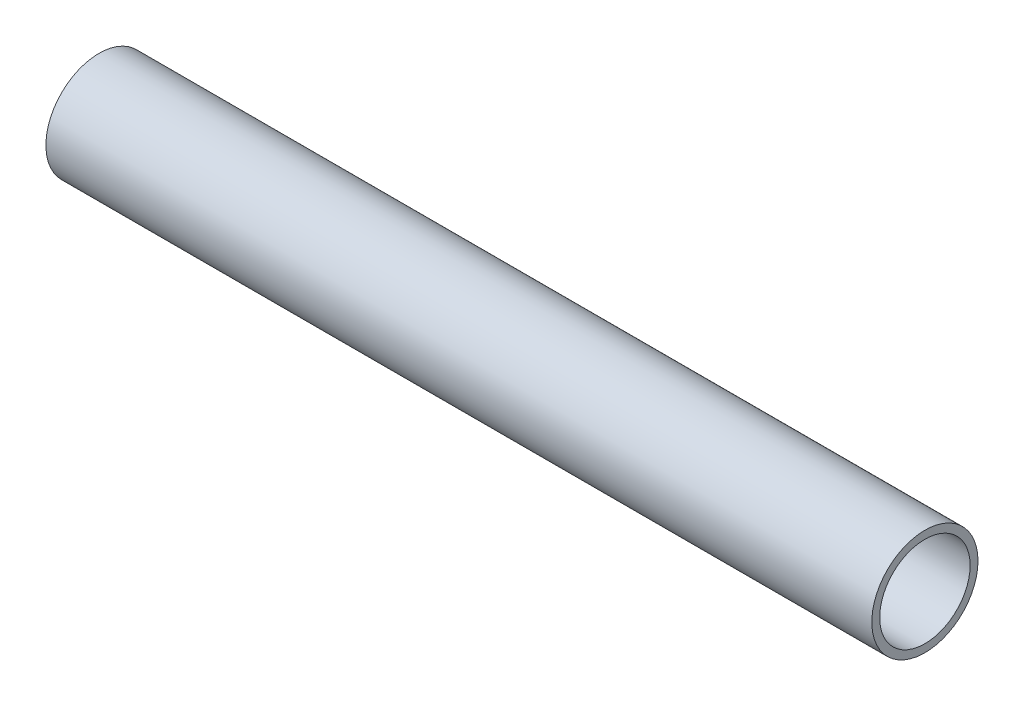
ISO-10303-21;
HEADER;
FILE_DESCRIPTION(('STEP AP214'),'2;1');
FILE_NAME('part.step','',(''),(''),'','','');
FILE_SCHEMA(('AUTOMOTIVE_DESIGN { 1 0 10303 214 1 1 1 1 }'));
ENDSEC;
DATA;
#1=APPLICATION_CONTEXT('core data for automotive mechanical design processes');
#2=APPLICATION_PROTOCOL_DEFINITION('international standard','automotive_design',2000,#1);
#3=PRODUCT_CONTEXT('',#1,'mechanical');
#4=PRODUCT('Part','Part','',(#3));
#5=PRODUCT_RELATED_PRODUCT_CATEGORY('part','',(#4));
#6=PRODUCT_DEFINITION_FORMATION('','',#4);
#7=PRODUCT_DEFINITION_CONTEXT('part definition',#1,'design');
#8=PRODUCT_DEFINITION('design','',#6,#7);
#9=PRODUCT_DEFINITION_SHAPE('','',#8);
#10=(LENGTH_UNIT() NAMED_UNIT(*) SI_UNIT(.MILLI.,.METRE.));
#11=(NAMED_UNIT(*) PLANE_ANGLE_UNIT() SI_UNIT($,.RADIAN.));
#12=(NAMED_UNIT(*) SI_UNIT($,.STERADIAN.) SOLID_ANGLE_UNIT());
#13=UNCERTAINTY_MEASURE_WITH_UNIT(LENGTH_MEASURE(1.E-05),#10,'distance_accuracy_value','');
#14=(GEOMETRIC_REPRESENTATION_CONTEXT(3) GLOBAL_UNCERTAINTY_ASSIGNED_CONTEXT((#13)) GLOBAL_UNIT_ASSIGNED_CONTEXT((#10,
#11,#12)) REPRESENTATION_CONTEXT('',''));
#15=CARTESIAN_POINT('',(0.,0.,0.));
#16=DIRECTION('',(0.,0.,1.));
#17=DIRECTION('',(1.,0.,0.));
#18=AXIS2_PLACEMENT_3D('',#15,#16,#17);
#19=CARTESIAN_POINT('',(-190.,300.,-250.));
#20=DIRECTION('',(-1.,0.,0.));
#21=DIRECTION('',(0.,0.,-1.));
#22=AXIS2_PLACEMENT_3D('',#19,#20,#21);
#23=CYLINDRICAL_SURFACE('',#22,13.5);
#24=CARTESIAN_POINT('',(-190.,300.,-250.));
#25=DIRECTION('',(1.,0.,0.));
#26=DIRECTION('',(0.,0.,-1.));
#27=AXIS2_PLACEMENT_3D('',#24,#25,#26);
#28=CIRCLE('',#27,13.5);
#29=CARTESIAN_POINT('',(-190.,300.,-263.5));
#30=VERTEX_POINT('',#29);
#31=EDGE_CURVE('E10',#30,#30,#28,.T.);
#32=CARTESIAN_POINT('',(-400.,300.,-250.));
#33=DIRECTION('',(1.,0.,0.));
#34=DIRECTION('',(0.,0.,-1.));
#35=AXIS2_PLACEMENT_3D('',#32,#33,#34);
#36=CIRCLE('',#35,13.5);
#37=CARTESIAN_POINT('',(-400.,300.,-263.5));
#38=VERTEX_POINT('',#37);
#39=EDGE_CURVE('E47',#38,#38,#36,.T.);
#40=CARTESIAN_POINT('',(-190.,300.,-263.5));
#41=CARTESIAN_POINT('',(-192.1875,300.,-263.5));
#42=CARTESIAN_POINT('',(-194.375,300.,-263.5));
#43=CARTESIAN_POINT('',(-198.75,300.,-263.5));
#44=CARTESIAN_POINT('',(-200.9375,300.,-263.5));
#45=CARTESIAN_POINT('',(-205.3125,300.,-263.5));
#46=CARTESIAN_POINT('',(-207.5,300.,-263.5));
#47=CARTESIAN_POINT('',(-211.875,300.,-263.5));
#48=CARTESIAN_POINT('',(-214.0625,300.,-263.5));
#49=CARTESIAN_POINT('',(-218.4375,300.,-263.5));
#50=CARTESIAN_POINT('',(-220.625,300.,-263.5));
#51=CARTESIAN_POINT('',(-225.,300.,-263.5));
#52=CARTESIAN_POINT('',(-227.1875,300.,-263.5));
#53=CARTESIAN_POINT('',(-231.5625,300.,-263.5));
#54=CARTESIAN_POINT('',(-233.75,300.,-263.5));
#55=CARTESIAN_POINT('',(-238.125,300.,-263.5));
#56=CARTESIAN_POINT('',(-240.3125,300.,-263.5));
#57=CARTESIAN_POINT('',(-244.6875,300.,-263.5));
#58=CARTESIAN_POINT('',(-246.875,300.,-263.5));
#59=CARTESIAN_POINT('',(-251.25,300.,-263.5));
#60=CARTESIAN_POINT('',(-253.4375,300.,-263.5));
#61=CARTESIAN_POINT('',(-257.8125,300.,-263.5));
#62=CARTESIAN_POINT('',(-260.,300.,-263.5));
#63=CARTESIAN_POINT('',(-264.375,300.,-263.5));
#64=CARTESIAN_POINT('',(-266.5625,300.,-263.5));
#65=CARTESIAN_POINT('',(-270.9375,300.,-263.5));
#66=CARTESIAN_POINT('',(-273.125,300.,-263.5));
#67=CARTESIAN_POINT('',(-277.5,300.,-263.5));
#68=CARTESIAN_POINT('',(-279.6875,300.,-263.5));
#69=CARTESIAN_POINT('',(-284.0625,300.,-263.5));
#70=CARTESIAN_POINT('',(-286.25,300.,-263.5));
#71=CARTESIAN_POINT('',(-290.625,300.,-263.5));
#72=CARTESIAN_POINT('',(-292.8125,300.,-263.5));
#73=CARTESIAN_POINT('',(-297.1875,300.,-263.5));
#74=CARTESIAN_POINT('',(-299.375,300.,-263.5));
#75=CARTESIAN_POINT('',(-303.75,300.,-263.5));
#76=CARTESIAN_POINT('',(-305.9375,300.,-263.5));
#77=CARTESIAN_POINT('',(-310.3125,300.,-263.5));
#78=CARTESIAN_POINT('',(-312.5,300.,-263.5));
#79=CARTESIAN_POINT('',(-316.875,300.,-263.5));
#80=CARTESIAN_POINT('',(-319.0625,300.,-263.5));
#81=CARTESIAN_POINT('',(-323.4375,300.,-263.5));
#82=CARTESIAN_POINT('',(-325.625,300.,-263.5));
#83=CARTESIAN_POINT('',(-330.,300.,-263.5));
#84=CARTESIAN_POINT('',(-332.1875,300.,-263.5));
#85=CARTESIAN_POINT('',(-336.5625,300.,-263.5));
#86=CARTESIAN_POINT('',(-338.75,300.,-263.5));
#87=CARTESIAN_POINT('',(-343.125,300.,-263.5));
#88=CARTESIAN_POINT('',(-345.3125,300.,-263.5));
#89=CARTESIAN_POINT('',(-349.6875,300.,-263.5));
#90=CARTESIAN_POINT('',(-351.875,300.,-263.5));
#91=CARTESIAN_POINT('',(-356.25,300.,-263.5));
#92=CARTESIAN_POINT('',(-358.4375,300.,-263.5));
#93=CARTESIAN_POINT('',(-362.8125,300.,-263.5));
#94=CARTESIAN_POINT('',(-365.,300.,-263.5));
#95=CARTESIAN_POINT('',(-369.375,300.,-263.5));
#96=CARTESIAN_POINT('',(-371.5625,300.,-263.5));
#97=CARTESIAN_POINT('',(-375.9375,300.,-263.5));
#98=CARTESIAN_POINT('',(-378.125,300.,-263.5));
#99=CARTESIAN_POINT('',(-382.5,300.,-263.5));
#100=CARTESIAN_POINT('',(-384.6875,300.,-263.5));
#101=CARTESIAN_POINT('',(-389.0625,300.,-263.5));
#102=CARTESIAN_POINT('',(-391.25,300.,-263.5));
#103=CARTESIAN_POINT('',(-395.625,300.,-263.5));
#104=CARTESIAN_POINT('',(-397.8125,300.,-263.5));
#105=CARTESIAN_POINT('',(-400.,300.,-263.5));
#106=B_SPLINE_CURVE_WITH_KNOTS('',3,(#40,#41,#42,#43,#44,#45,#46,#47,#48,#49,#50,#51,#52,#53,
#54,#55,#56,#57,#58,#59,#60,#61,#62,#63,#64,#65,#66,#67,#68,#69,#70,#71,#72,#73,#74,#75,#76,#77,
#78,#79,#80,#81,#82,#83,#84,#85,#86,#87,#88,#89,#90,#91,#92,#93,#94,#95,#96,#97,#98,#99,#100,
#101,#102,#103,#104,#105),.UNSPECIFIED.,.F.,.F.,(4,2,2,2,2,2,2,2,2,2,2,2,2,2,2,2,2,2,2,2,2,2,2,
2,2,2,2,2,2,2,2,2,4),(0.,6.56250000000003,13.125,19.6875,26.25,32.8125,39.375,45.9375,52.5,
59.0625,65.625,72.1875,78.75,85.3125,91.875,98.4375,105.,111.5625,118.125,124.6875,131.25,
137.8125,144.375,150.9375,157.5,164.0625,170.625,177.1875,183.75,190.3125,196.875,203.4375,
210.),.UNSPECIFIED.);
#107=EDGE_CURVE('BSEAM37',#30,#38,#106,.T.);
#108=ORIENTED_EDGE('',*,*,#31,.F.);
#109=ORIENTED_EDGE('',*,*,#39,.T.);
#110=ORIENTED_EDGE('',*,*,#107,.T.);
#111=ORIENTED_EDGE('',*,*,#107,.F.);
#112=EDGE_LOOP('',(#108,#110,#109,#111));
#113=FACE_BOUND('',#112,.T.);
#114=ADVANCED_FACE('F37',(#113),#23,.T.);
#115=CARTESIAN_POINT('',(-190.,300.,-250.));
#116=DIRECTION('',(-1.,0.,0.));
#117=DIRECTION('',(0.,0.,-1.));
#118=AXIS2_PLACEMENT_3D('',#115,#116,#117);
#119=PLANE('',#118);
#120=CARTESIAN_POINT('',(-190.,300.,-250.));
#121=DIRECTION('',(1.,0.,0.));
#122=DIRECTION('',(0.,0.,-1.));
#123=AXIS2_PLACEMENT_3D('',#120,#121,#122);
#124=CIRCLE('',#123,11.5);
#125=CARTESIAN_POINT('',(-190.,300.,-261.5));
#126=VERTEX_POINT('',#125);
#127=EDGE_CURVE('E43',#126,#126,#124,.T.);
#128=ORIENTED_EDGE('',*,*,#127,.F.);
#129=EDGE_LOOP('',(#128));
#130=FACE_BOUND('',#129,.T.);
#131=ORIENTED_EDGE('',*,*,#31,.T.);
#132=EDGE_LOOP('',(#131));
#133=FACE_BOUND('',#132,.T.);
#134=ADVANCED_FACE('F61',(#130,#133),#119,.F.);
#135=CARTESIAN_POINT('',(-190.,300.,-250.));
#136=DIRECTION('',(-1.,0.,0.));
#137=DIRECTION('',(0.,0.,-1.));
#138=AXIS2_PLACEMENT_3D('',#135,#136,#137);
#139=CYLINDRICAL_SURFACE('',#138,11.5);
#140=CARTESIAN_POINT('',(-400.,300.,-250.));
#141=DIRECTION('',(1.,0.,0.));
#142=DIRECTION('',(0.,0.,-1.));
#143=AXIS2_PLACEMENT_3D('',#140,#141,#142);
#144=CIRCLE('',#143,11.5);
#145=CARTESIAN_POINT('',(-400.,300.,-261.5));
#146=VERTEX_POINT('',#145);
#147=EDGE_CURVE('E51',#146,#146,#144,.T.);
#148=CARTESIAN_POINT('',(-190.,300.,-261.5));
#149=CARTESIAN_POINT('',(-192.1875,300.,-261.5));
#150=CARTESIAN_POINT('',(-194.375,300.,-261.5));
#151=CARTESIAN_POINT('',(-198.75,300.,-261.5));
#152=CARTESIAN_POINT('',(-200.9375,300.,-261.5));
#153=CARTESIAN_POINT('',(-205.3125,300.,-261.5));
#154=CARTESIAN_POINT('',(-207.5,300.,-261.5));
#155=CARTESIAN_POINT('',(-211.875,300.,-261.5));
#156=CARTESIAN_POINT('',(-214.0625,300.,-261.5));
#157=CARTESIAN_POINT('',(-218.4375,300.,-261.5));
#158=CARTESIAN_POINT('',(-220.625,300.,-261.5));
#159=CARTESIAN_POINT('',(-225.,300.,-261.5));
#160=CARTESIAN_POINT('',(-227.1875,300.,-261.5));
#161=CARTESIAN_POINT('',(-231.5625,300.,-261.5));
#162=CARTESIAN_POINT('',(-233.75,300.,-261.5));
#163=CARTESIAN_POINT('',(-238.125,300.,-261.5));
#164=CARTESIAN_POINT('',(-240.3125,300.,-261.5));
#165=CARTESIAN_POINT('',(-244.6875,300.,-261.5));
#166=CARTESIAN_POINT('',(-246.875,300.,-261.5));
#167=CARTESIAN_POINT('',(-251.25,300.,-261.5));
#168=CARTESIAN_POINT('',(-253.4375,300.,-261.5));
#169=CARTESIAN_POINT('',(-257.8125,300.,-261.5));
#170=CARTESIAN_POINT('',(-260.,300.,-261.5));
#171=CARTESIAN_POINT('',(-264.375,300.,-261.5));
#172=CARTESIAN_POINT('',(-266.5625,300.,-261.5));
#173=CARTESIAN_POINT('',(-270.9375,300.,-261.5));
#174=CARTESIAN_POINT('',(-273.125,300.,-261.5));
#175=CARTESIAN_POINT('',(-277.5,300.,-261.5));
#176=CARTESIAN_POINT('',(-279.6875,300.,-261.5));
#177=CARTESIAN_POINT('',(-284.0625,300.,-261.5));
#178=CARTESIAN_POINT('',(-286.25,300.,-261.5));
#179=CARTESIAN_POINT('',(-290.625,300.,-261.5));
#180=CARTESIAN_POINT('',(-292.8125,300.,-261.5));
#181=CARTESIAN_POINT('',(-297.1875,300.,-261.5));
#182=CARTESIAN_POINT('',(-299.375,300.,-261.5));
#183=CARTESIAN_POINT('',(-303.75,300.,-261.5));
#184=CARTESIAN_POINT('',(-305.9375,300.,-261.5));
#185=CARTESIAN_POINT('',(-310.3125,300.,-261.5));
#186=CARTESIAN_POINT('',(-312.5,300.,-261.5));
#187=CARTESIAN_POINT('',(-316.875,300.,-261.5));
#188=CARTESIAN_POINT('',(-319.0625,300.,-261.5));
#189=CARTESIAN_POINT('',(-323.4375,300.,-261.5));
#190=CARTESIAN_POINT('',(-325.625,300.,-261.5));
#191=CARTESIAN_POINT('',(-330.,300.,-261.5));
#192=CARTESIAN_POINT('',(-332.1875,300.,-261.5));
#193=CARTESIAN_POINT('',(-336.5625,300.,-261.5));
#194=CARTESIAN_POINT('',(-338.75,300.,-261.5));
#195=CARTESIAN_POINT('',(-343.125,300.,-261.5));
#196=CARTESIAN_POINT('',(-345.3125,300.,-261.5));
#197=CARTESIAN_POINT('',(-349.6875,300.,-261.5));
#198=CARTESIAN_POINT('',(-351.875,300.,-261.5));
#199=CARTESIAN_POINT('',(-356.25,300.,-261.5));
#200=CARTESIAN_POINT('',(-358.4375,300.,-261.5));
#201=CARTESIAN_POINT('',(-362.8125,300.,-261.5));
#202=CARTESIAN_POINT('',(-365.,300.,-261.5));
#203=CARTESIAN_POINT('',(-369.375,300.,-261.5));
#204=CARTESIAN_POINT('',(-371.5625,300.,-261.5));
#205=CARTESIAN_POINT('',(-375.9375,300.,-261.5));
#206=CARTESIAN_POINT('',(-378.125,300.,-261.5));
#207=CARTESIAN_POINT('',(-382.5,300.,-261.5));
#208=CARTESIAN_POINT('',(-384.6875,300.,-261.5));
#209=CARTESIAN_POINT('',(-389.0625,300.,-261.5));
#210=CARTESIAN_POINT('',(-391.25,300.,-261.5));
#211=CARTESIAN_POINT('',(-395.625,300.,-261.5));
#212=CARTESIAN_POINT('',(-397.8125,300.,-261.5));
#213=CARTESIAN_POINT('',(-400.,300.,-261.5));
#214=B_SPLINE_CURVE_WITH_KNOTS('',3,(#148,#149,#150,#151,#152,#153,#154,#155,#156,#157,#158,
#159,#160,#161,#162,#163,#164,#165,#166,#167,#168,#169,#170,#171,#172,#173,#174,#175,#176,#177,
#178,#179,#180,#181,#182,#183,#184,#185,#186,#187,#188,#189,#190,#191,#192,#193,#194,#195,#196,
#197,#198,#199,#200,#201,#202,#203,#204,#205,#206,#207,#208,#209,#210,#211,#212,#213),
.UNSPECIFIED.,.F.,.F.,(4,2,2,2,2,2,2,2,2,2,2,2,2,2,2,2,2,2,2,2,2,2,2,2,2,2,2,2,2,2,2,2,4),(0.,
6.56250000000003,13.125,19.6875,26.25,32.8125,39.375,45.9375,52.5,59.0625,65.625,72.1875,78.75,
85.3125,91.875,98.4375,105.,111.5625,118.125,124.6875,131.25,137.8125,144.375,150.9375,157.5,
164.0625,170.625,177.1875,183.75,190.3125,196.875,203.4375,210.),.UNSPECIFIED.);
#215=EDGE_CURVE('BSEAM59',#126,#146,#214,.T.);
#216=ORIENTED_EDGE('',*,*,#127,.T.);
#217=ORIENTED_EDGE('',*,*,#147,.F.);
#218=ORIENTED_EDGE('',*,*,#215,.T.);
#219=ORIENTED_EDGE('',*,*,#215,.F.);
#220=EDGE_LOOP('',(#216,#218,#217,#219));
#221=FACE_BOUND('',#220,.T.);
#222=ADVANCED_FACE('F59',(#221),#139,.F.);
#223=CARTESIAN_POINT('',(-400.,300.,-250.));
#224=DIRECTION('',(-1.,0.,0.));
#225=DIRECTION('',(0.,0.,-1.));
#226=AXIS2_PLACEMENT_3D('',#223,#224,#225);
#227=PLANE('',#226);
#228=ORIENTED_EDGE('',*,*,#39,.F.);
#229=EDGE_LOOP('',(#228));
#230=FACE_BOUND('',#229,.T.);
#231=ORIENTED_EDGE('',*,*,#147,.T.);
#232=EDGE_LOOP('',(#231));
#233=FACE_BOUND('',#232,.T.);
#234=ADVANCED_FACE('F57',(#230,#233),#227,.T.);
#235=CLOSED_SHELL('',(#114,#134,#222,#234));
#236=MANIFOLD_SOLID_BREP('B2',#235);
#237=ADVANCED_BREP_SHAPE_REPRESENTATION('',(#18,#236),#14);
#238=SHAPE_DEFINITION_REPRESENTATION(#9,#237);
ENDSEC;
END-ISO-10303-21;
